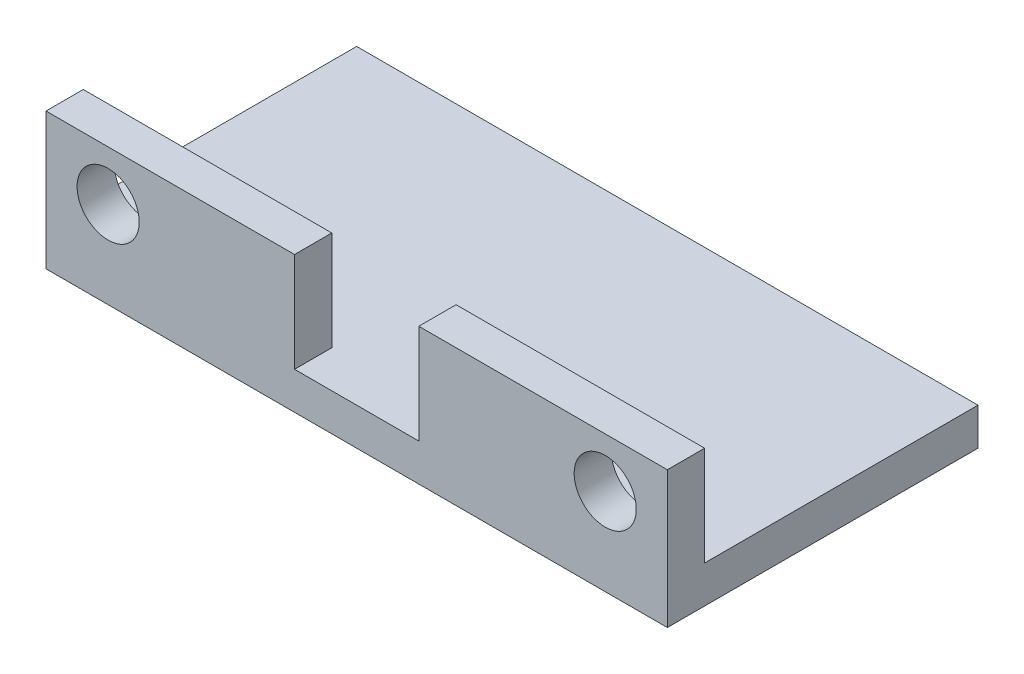
ISO-10303-21;
HEADER;
FILE_DESCRIPTION(('STEP AP214'),'2;1');
FILE_NAME('part.step','',(''),(''),'','','');
FILE_SCHEMA(('AUTOMOTIVE_DESIGN { 1 0 10303 214 1 1 1 1 }'));
ENDSEC;
DATA;
#1=APPLICATION_CONTEXT('core data for automotive mechanical design processes');
#2=APPLICATION_PROTOCOL_DEFINITION('international standard','automotive_design',2000,#1);
#3=PRODUCT_CONTEXT('',#1,'mechanical');
#4=PRODUCT('Part','Part','',(#3));
#5=PRODUCT_RELATED_PRODUCT_CATEGORY('part','',(#4));
#6=PRODUCT_DEFINITION_FORMATION('','',#4);
#7=PRODUCT_DEFINITION_CONTEXT('part definition',#1,'design');
#8=PRODUCT_DEFINITION('design','',#6,#7);
#9=PRODUCT_DEFINITION_SHAPE('','',#8);
#10=(LENGTH_UNIT() NAMED_UNIT(*) SI_UNIT(.MILLI.,.METRE.));
#11=(NAMED_UNIT(*) PLANE_ANGLE_UNIT() SI_UNIT($,.RADIAN.));
#12=(NAMED_UNIT(*) SI_UNIT($,.STERADIAN.) SOLID_ANGLE_UNIT());
#13=UNCERTAINTY_MEASURE_WITH_UNIT(LENGTH_MEASURE(1.E-05),#10,'distance_accuracy_value','');
#14=(GEOMETRIC_REPRESENTATION_CONTEXT(3) GLOBAL_UNCERTAINTY_ASSIGNED_CONTEXT((#13)) GLOBAL_UNIT_ASSIGNED_CONTEXT((#10,
#11,#12)) REPRESENTATION_CONTEXT('',''));
#15=CARTESIAN_POINT('',(0.,0.,0.));
#16=DIRECTION('',(0.,0.,1.));
#17=DIRECTION('',(1.,0.,0.));
#18=AXIS2_PLACEMENT_3D('',#15,#16,#17);
#19=CARTESIAN_POINT('',(0.,3.81,0.));
#20=DIRECTION('',(0.,1.,0.));
#21=DIRECTION('',(0.,0.,1.));
#22=AXIS2_PLACEMENT_3D('',#19,#20,#21);
#23=PLANE('',#22);
#24=DIRECTION('',(1.,0.,0.));
#25=VECTOR('',#24,1.);
#26=CARTESIAN_POINT('',(-31.75,3.81,15.875));
#27=LINE('',#26,#25);
#28=CARTESIAN_POINT('',(-6.34999999999999,3.81,15.875));
#29=VERTEX_POINT('',#28);
#30=CARTESIAN_POINT('',(6.35000000000001,3.81,15.875));
#31=VERTEX_POINT('',#30);
#32=EDGE_CURVE('E195',#29,#31,#27,.T.);
#33=ORIENTED_EDGE('',*,*,#32,.T.);
#34=DIRECTION('',(0.,0.,1.));
#35=VECTOR('',#34,1.);
#36=CARTESIAN_POINT('',(6.35000000000001,3.81,15.875));
#37=LINE('',#36,#35);
#38=CARTESIAN_POINT('',(6.35000000000001,3.81,12.065));
#39=VERTEX_POINT('',#38);
#40=EDGE_CURVE('E144',#39,#31,#37,.T.);
#41=ORIENTED_EDGE('',*,*,#40,.F.);
#42=DIRECTION('',(-1.,0.,0.));
#43=VECTOR('',#42,1.);
#44=CARTESIAN_POINT('',(6.35000000000001,3.81,12.065));
#45=LINE('',#44,#43);
#46=CARTESIAN_POINT('',(31.75,3.81,12.065));
#47=VERTEX_POINT('',#46);
#48=EDGE_CURVE('E140',#47,#39,#45,.T.);
#49=ORIENTED_EDGE('',*,*,#48,.F.);
#50=DIRECTION('',(0.,0.,-1.));
#51=VECTOR('',#50,1.);
#52=CARTESIAN_POINT('',(31.75,3.81,-15.875));
#53=LINE('',#52,#51);
#54=CARTESIAN_POINT('',(31.75,3.81,-15.875));
#55=VERTEX_POINT('',#54);
#56=EDGE_CURVE('E185',#47,#55,#53,.T.);
#57=ORIENTED_EDGE('',*,*,#56,.T.);
#58=DIRECTION('',(-1.,0.,0.));
#59=VECTOR('',#58,1.);
#60=CARTESIAN_POINT('',(-31.75,3.81,-15.875));
#61=LINE('',#60,#59);
#62=CARTESIAN_POINT('',(-31.75,3.81,-15.875));
#63=VERTEX_POINT('',#62);
#64=EDGE_CURVE('E188',#55,#63,#61,.T.);
#65=ORIENTED_EDGE('',*,*,#64,.T.);
#66=DIRECTION('',(0.,0.,1.));
#67=VECTOR('',#66,1.);
#68=CARTESIAN_POINT('',(-31.75,3.81,-15.875));
#69=LINE('',#68,#67);
#70=CARTESIAN_POINT('',(-31.75,3.81,12.065));
#71=VERTEX_POINT('',#70);
#72=EDGE_CURVE('E192',#63,#71,#69,.T.);
#73=ORIENTED_EDGE('',*,*,#72,.T.);
#74=DIRECTION('',(-1.,0.,0.));
#75=VECTOR('',#74,1.);
#76=CARTESIAN_POINT('',(-6.34999999999999,3.81,12.065));
#77=LINE('',#76,#75);
#78=CARTESIAN_POINT('',(-6.34999999999999,3.81,12.065));
#79=VERTEX_POINT('',#78);
#80=EDGE_CURVE('E64',#79,#71,#77,.T.);
#81=ORIENTED_EDGE('',*,*,#80,.F.);
#82=DIRECTION('',(0.,0.,-1.));
#83=VECTOR('',#82,1.);
#84=CARTESIAN_POINT('',(-6.34999999999999,3.81,15.875));
#85=LINE('',#84,#83);
#86=EDGE_CURVE('E147',#29,#79,#85,.T.);
#87=ORIENTED_EDGE('',*,*,#86,.F.);
#88=EDGE_LOOP('',(#33,#41,#49,#57,#65,#73,#81,#87));
#89=FACE_BOUND('',#88,.T.);
#90=ADVANCED_FACE('F40',(#89),#23,.T.);
#91=CARTESIAN_POINT('',(31.75,3.81,-15.875));
#92=DIRECTION('',(-1.,0.,0.));
#93=DIRECTION('',(0.,0.,1.));
#94=AXIS2_PLACEMENT_3D('',#91,#92,#93);
#95=PLANE('',#94);
#96=DIRECTION('',(0.,0.,-1.));
#97=VECTOR('',#96,1.);
#98=CARTESIAN_POINT('',(31.75,0.,-15.875));
#99=LINE('',#98,#97);
#100=CARTESIAN_POINT('',(31.75,0.,15.875));
#101=VERTEX_POINT('',#100);
#102=CARTESIAN_POINT('',(31.75,0.,-15.875));
#103=VERTEX_POINT('',#102);
#104=EDGE_CURVE('E184',#101,#103,#99,.T.);
#105=ORIENTED_EDGE('',*,*,#104,.T.);
#106=DIRECTION('',(0.,-1.,0.));
#107=VECTOR('',#106,1.);
#108=CARTESIAN_POINT('',(31.75,3.81,-15.875));
#109=LINE('',#108,#107);
#110=EDGE_CURVE('E11',#55,#103,#109,.T.);
#111=ORIENTED_EDGE('',*,*,#110,.F.);
#112=ORIENTED_EDGE('',*,*,#56,.F.);
#113=DIRECTION('',(0.,-1.,0.));
#114=VECTOR('',#113,1.);
#115=CARTESIAN_POINT('',(31.75,13.97,12.065));
#116=LINE('',#115,#114);
#117=CARTESIAN_POINT('',(31.75,13.97,12.065));
#118=VERTEX_POINT('',#117);
#119=EDGE_CURVE('E56',#118,#47,#116,.T.);
#120=ORIENTED_EDGE('',*,*,#119,.F.);
#121=DIRECTION('',(0.,0.,-1.));
#122=VECTOR('',#121,1.);
#123=CARTESIAN_POINT('',(31.75,13.97,15.875));
#124=LINE('',#123,#122);
#125=CARTESIAN_POINT('',(31.75,13.97,15.875));
#126=VERTEX_POINT('',#125);
#127=EDGE_CURVE('E130',#126,#118,#124,.T.);
#128=ORIENTED_EDGE('',*,*,#127,.F.);
#129=DIRECTION('',(0.,-1.,0.));
#130=VECTOR('',#129,1.);
#131=CARTESIAN_POINT('',(31.75,3.81,15.875));
#132=LINE('',#131,#130);
#133=EDGE_CURVE('E126',#126,#101,#132,.T.);
#134=ORIENTED_EDGE('',*,*,#133,.T.);
#135=EDGE_LOOP('',(#105,#111,#112,#120,#128,#134));
#136=FACE_BOUND('',#135,.T.);
#137=ADVANCED_FACE('F42',(#136),#95,.F.);
#138=CARTESIAN_POINT('',(-31.75,3.81,-15.875));
#139=DIRECTION('',(0.,0.,1.));
#140=DIRECTION('',(1.,0.,0.));
#141=AXIS2_PLACEMENT_3D('',#138,#139,#140);
#142=PLANE('',#141);
#143=DIRECTION('',(-1.,0.,0.));
#144=VECTOR('',#143,1.);
#145=CARTESIAN_POINT('',(-31.75,0.,-15.875));
#146=LINE('',#145,#144);
#147=CARTESIAN_POINT('',(-31.75,0.,-15.875));
#148=VERTEX_POINT('',#147);
#149=EDGE_CURVE('E201',#103,#148,#146,.T.);
#150=ORIENTED_EDGE('',*,*,#149,.T.);
#151=DIRECTION('',(0.,-1.,0.));
#152=VECTOR('',#151,1.);
#153=CARTESIAN_POINT('',(-31.75,3.81,-15.875));
#154=LINE('',#153,#152);
#155=EDGE_CURVE('E49',#63,#148,#154,.T.);
#156=ORIENTED_EDGE('',*,*,#155,.F.);
#157=ORIENTED_EDGE('',*,*,#64,.F.);
#158=ORIENTED_EDGE('',*,*,#110,.T.);
#159=EDGE_LOOP('',(#150,#156,#157,#158));
#160=FACE_BOUND('',#159,.T.);
#161=ADVANCED_FACE('F267',(#160),#142,.F.);
#162=CARTESIAN_POINT('',(-31.75,3.81,-15.875));
#163=DIRECTION('',(1.,0.,0.));
#164=DIRECTION('',(0.,0.,-1.));
#165=AXIS2_PLACEMENT_3D('',#162,#163,#164);
#166=PLANE('',#165);
#167=DIRECTION('',(0.,0.,1.));
#168=VECTOR('',#167,1.);
#169=CARTESIAN_POINT('',(-31.75,0.,-15.875));
#170=LINE('',#169,#168);
#171=CARTESIAN_POINT('',(-31.75,0.,15.875));
#172=VERTEX_POINT('',#171);
#173=EDGE_CURVE('E204',#148,#172,#170,.T.);
#174=ORIENTED_EDGE('',*,*,#173,.T.);
#175=DIRECTION('',(0.,-1.,0.));
#176=VECTOR('',#175,1.);
#177=CARTESIAN_POINT('',(-31.75,3.81,15.875));
#178=LINE('',#177,#176);
#179=CARTESIAN_POINT('',(-31.75,13.97,15.875));
#180=VERTEX_POINT('',#179);
#181=EDGE_CURVE('E211',#180,#172,#178,.T.);
#182=ORIENTED_EDGE('',*,*,#181,.F.);
#183=DIRECTION('',(0.,0.,1.));
#184=VECTOR('',#183,1.);
#185=CARTESIAN_POINT('',(-31.75,13.97,15.875));
#186=LINE('',#185,#184);
#187=CARTESIAN_POINT('',(-31.75,13.97,12.065));
#188=VERTEX_POINT('',#187);
#189=EDGE_CURVE('E164',#188,#180,#186,.T.);
#190=ORIENTED_EDGE('',*,*,#189,.F.);
#191=DIRECTION('',(0.,-1.,0.));
#192=VECTOR('',#191,1.);
#193=CARTESIAN_POINT('',(-31.75,13.97,12.065));
#194=LINE('',#193,#192);
#195=EDGE_CURVE('E177',#188,#71,#194,.T.);
#196=ORIENTED_EDGE('',*,*,#195,.T.);
#197=ORIENTED_EDGE('',*,*,#72,.F.);
#198=ORIENTED_EDGE('',*,*,#155,.T.);
#199=EDGE_LOOP('',(#174,#182,#190,#196,#197,#198));
#200=FACE_BOUND('',#199,.T.);
#201=ADVANCED_FACE('F220',(#200),#166,.F.);
#202=CARTESIAN_POINT('',(-31.75,3.81,15.875));
#203=DIRECTION('',(0.,0.,-1.));
#204=DIRECTION('',(-1.,0.,0.));
#205=AXIS2_PLACEMENT_3D('',#202,#203,#204);
#206=PLANE('',#205);
#207=CARTESIAN_POINT('',(-25.4,8.89,15.875));
#208=DIRECTION('',(0.,0.,-1.));
#209=DIRECTION('',(-1.,0.,0.));
#210=AXIS2_PLACEMENT_3D('',#207,#208,#209);
#211=CIRCLE('',#210,3.175);
#212=CARTESIAN_POINT('',(-28.575,8.89,15.875));
#213=VERTEX_POINT('',#212);
#214=EDGE_CURVE('E238',#213,#213,#211,.F.);
#215=ORIENTED_EDGE('',*,*,#214,.F.);
#216=EDGE_LOOP('',(#215));
#217=FACE_BOUND('',#216,.T.);
#218=CARTESIAN_POINT('',(25.4,8.89,15.875));
#219=DIRECTION('',(0.,0.,-1.));
#220=DIRECTION('',(-1.,0.,0.));
#221=AXIS2_PLACEMENT_3D('',#218,#219,#220);
#222=CIRCLE('',#221,3.175);
#223=CARTESIAN_POINT('',(22.225,8.89,15.875));
#224=VERTEX_POINT('',#223);
#225=EDGE_CURVE('E357',#224,#224,#222,.F.);
#226=ORIENTED_EDGE('',*,*,#225,.F.);
#227=EDGE_LOOP('',(#226));
#228=FACE_BOUND('',#227,.T.);
#229=DIRECTION('',(1.,0.,0.));
#230=VECTOR('',#229,1.);
#231=CARTESIAN_POINT('',(-31.75,0.,15.875));
#232=LINE('',#231,#230);
#233=EDGE_CURVE('E189',#172,#101,#232,.T.);
#234=ORIENTED_EDGE('',*,*,#233,.T.);
#235=ORIENTED_EDGE('',*,*,#133,.F.);
#236=DIRECTION('',(1.,0.,0.));
#237=VECTOR('',#236,1.);
#238=CARTESIAN_POINT('',(6.35000000000001,13.97,15.875));
#239=LINE('',#238,#237);
#240=CARTESIAN_POINT('',(6.35000000000001,13.97,15.875));
#241=VERTEX_POINT('',#240);
#242=EDGE_CURVE('E118',#241,#126,#239,.T.);
#243=ORIENTED_EDGE('',*,*,#242,.F.);
#244=DIRECTION('',(0.,-1.,0.));
#245=VECTOR('',#244,1.);
#246=CARTESIAN_POINT('',(6.35000000000001,13.97,15.875));
#247=LINE('',#246,#245);
#248=EDGE_CURVE('E123',#241,#31,#247,.T.);
#249=ORIENTED_EDGE('',*,*,#248,.T.);
#250=ORIENTED_EDGE('',*,*,#32,.F.);
#251=DIRECTION('',(0.,-1.,0.));
#252=VECTOR('',#251,1.);
#253=CARTESIAN_POINT('',(-6.34999999999999,13.97,15.875));
#254=LINE('',#253,#252);
#255=CARTESIAN_POINT('',(-6.34999999999999,13.97,15.875));
#256=VERTEX_POINT('',#255);
#257=EDGE_CURVE('E170',#256,#29,#254,.T.);
#258=ORIENTED_EDGE('',*,*,#257,.F.);
#259=DIRECTION('',(1.,0.,0.));
#260=VECTOR('',#259,1.);
#261=CARTESIAN_POINT('',(-6.34999999999999,13.97,15.875));
#262=LINE('',#261,#260);
#263=EDGE_CURVE('E168',#180,#256,#262,.T.);
#264=ORIENTED_EDGE('',*,*,#263,.F.);
#265=ORIENTED_EDGE('',*,*,#181,.T.);
#266=EDGE_LOOP('',(#234,#235,#243,#249,#250,#258,#264,#265));
#267=FACE_BOUND('',#266,.T.);
#268=ADVANCED_FACE('F120',(#217,#228,#267),#206,.F.);
#269=CARTESIAN_POINT('',(0.,0.,0.));
#270=DIRECTION('',(0.,1.,0.));
#271=DIRECTION('',(0.,0.,1.));
#272=AXIS2_PLACEMENT_3D('',#269,#270,#271);
#273=PLANE('',#272);
#274=ORIENTED_EDGE('',*,*,#104,.F.);
#275=ORIENTED_EDGE('',*,*,#233,.F.);
#276=ORIENTED_EDGE('',*,*,#173,.F.);
#277=ORIENTED_EDGE('',*,*,#149,.F.);
#278=EDGE_LOOP('',(#274,#275,#276,#277));
#279=FACE_BOUND('',#278,.T.);
#280=ADVANCED_FACE('F226',(#279),#273,.F.);
#281=CARTESIAN_POINT('',(-6.34999999999999,13.97,15.875));
#282=DIRECTION('',(-1.,0.,0.));
#283=DIRECTION('',(0.,0.,1.));
#284=AXIS2_PLACEMENT_3D('',#281,#282,#283);
#285=PLANE('',#284);
#286=ORIENTED_EDGE('',*,*,#86,.T.);
#287=DIRECTION('',(0.,-1.,0.));
#288=VECTOR('',#287,1.);
#289=CARTESIAN_POINT('',(-6.34999999999999,13.97,12.065));
#290=LINE('',#289,#288);
#291=CARTESIAN_POINT('',(-6.34999999999999,13.97,12.065));
#292=VERTEX_POINT('',#291);
#293=EDGE_CURVE('E181',#292,#79,#290,.T.);
#294=ORIENTED_EDGE('',*,*,#293,.F.);
#295=DIRECTION('',(0.,0.,-1.));
#296=VECTOR('',#295,1.);
#297=CARTESIAN_POINT('',(-6.34999999999999,13.97,15.875));
#298=LINE('',#297,#296);
#299=EDGE_CURVE('E157',#256,#292,#298,.T.);
#300=ORIENTED_EDGE('',*,*,#299,.F.);
#301=ORIENTED_EDGE('',*,*,#257,.T.);
#302=EDGE_LOOP('',(#286,#294,#300,#301));
#303=FACE_BOUND('',#302,.T.);
#304=ADVANCED_FACE('F244',(#303),#285,.F.);
#305=CARTESIAN_POINT('',(-6.34999999999999,13.97,12.065));
#306=DIRECTION('',(0.,0.,1.));
#307=DIRECTION('',(1.,0.,0.));
#308=AXIS2_PLACEMENT_3D('',#305,#306,#307);
#309=PLANE('',#308);
#310=CARTESIAN_POINT('',(-25.4,8.89,12.065));
#311=DIRECTION('',(0.,0.,-1.));
#312=DIRECTION('',(-1.,0.,0.));
#313=AXIS2_PLACEMENT_3D('',#310,#311,#312);
#314=CIRCLE('',#313,3.175);
#315=CARTESIAN_POINT('',(-28.575,8.89,12.065));
#316=VERTEX_POINT('',#315);
#317=EDGE_CURVE('E361',#316,#316,#314,.T.);
#318=ORIENTED_EDGE('',*,*,#317,.F.);
#319=EDGE_LOOP('',(#318));
#320=FACE_BOUND('',#319,.T.);
#321=ORIENTED_EDGE('',*,*,#80,.T.);
#322=ORIENTED_EDGE('',*,*,#195,.F.);
#323=DIRECTION('',(-1.,0.,0.));
#324=VECTOR('',#323,1.);
#325=CARTESIAN_POINT('',(-6.34999999999999,13.97,12.065));
#326=LINE('',#325,#324);
#327=EDGE_CURVE('E161',#292,#188,#326,.T.);
#328=ORIENTED_EDGE('',*,*,#327,.F.);
#329=ORIENTED_EDGE('',*,*,#293,.T.);
#330=EDGE_LOOP('',(#321,#322,#328,#329));
#331=FACE_BOUND('',#330,.T.);
#332=ADVANCED_FACE('F251',(#320,#331),#309,.F.);
#333=CARTESIAN_POINT('',(0.,13.97,0.));
#334=DIRECTION('',(0.,1.,0.));
#335=DIRECTION('',(0.,0.,1.));
#336=AXIS2_PLACEMENT_3D('',#333,#334,#335);
#337=PLANE('',#336);
#338=ORIENTED_EDGE('',*,*,#299,.T.);
#339=ORIENTED_EDGE('',*,*,#327,.T.);
#340=ORIENTED_EDGE('',*,*,#189,.T.);
#341=ORIENTED_EDGE('',*,*,#263,.T.);
#342=EDGE_LOOP('',(#338,#339,#340,#341));
#343=FACE_BOUND('',#342,.T.);
#344=ADVANCED_FACE('F247',(#343),#337,.T.);
#345=CARTESIAN_POINT('',(6.35000000000001,13.97,15.875));
#346=DIRECTION('',(1.,0.,0.));
#347=DIRECTION('',(0.,0.,-1.));
#348=AXIS2_PLACEMENT_3D('',#345,#346,#347);
#349=PLANE('',#348);
#350=ORIENTED_EDGE('',*,*,#40,.T.);
#351=ORIENTED_EDGE('',*,*,#248,.F.);
#352=DIRECTION('',(0.,0.,1.));
#353=VECTOR('',#352,1.);
#354=CARTESIAN_POINT('',(6.35000000000001,13.97,15.875));
#355=LINE('',#354,#353);
#356=CARTESIAN_POINT('',(6.35000000000001,13.97,12.065));
#357=VERTEX_POINT('',#356);
#358=EDGE_CURVE('E131',#357,#241,#355,.T.);
#359=ORIENTED_EDGE('',*,*,#358,.F.);
#360=DIRECTION('',(0.,-1.,0.));
#361=VECTOR('',#360,1.);
#362=CARTESIAN_POINT('',(6.35000000000001,13.97,12.065));
#363=LINE('',#362,#361);
#364=EDGE_CURVE('E153',#357,#39,#363,.T.);
#365=ORIENTED_EDGE('',*,*,#364,.T.);
#366=EDGE_LOOP('',(#350,#351,#359,#365));
#367=FACE_BOUND('',#366,.T.);
#368=ADVANCED_FACE('F142',(#367),#349,.F.);
#369=CARTESIAN_POINT('',(6.35000000000001,13.97,12.065));
#370=DIRECTION('',(0.,0.,1.));
#371=DIRECTION('',(1.,0.,0.));
#372=AXIS2_PLACEMENT_3D('',#369,#370,#371);
#373=PLANE('',#372);
#374=CARTESIAN_POINT('',(25.4,8.89,12.065));
#375=DIRECTION('',(0.,0.,-1.));
#376=DIRECTION('',(-1.,0.,0.));
#377=AXIS2_PLACEMENT_3D('',#374,#375,#376);
#378=CIRCLE('',#377,3.175);
#379=CARTESIAN_POINT('',(22.225,8.89,12.065));
#380=VERTEX_POINT('',#379);
#381=EDGE_CURVE('E354',#380,#380,#378,.T.);
#382=ORIENTED_EDGE('',*,*,#381,.F.);
#383=EDGE_LOOP('',(#382));
#384=FACE_BOUND('',#383,.T.);
#385=ORIENTED_EDGE('',*,*,#48,.T.);
#386=ORIENTED_EDGE('',*,*,#364,.F.);
#387=DIRECTION('',(-1.,0.,0.));
#388=VECTOR('',#387,1.);
#389=CARTESIAN_POINT('',(6.35000000000001,13.97,12.065));
#390=LINE('',#389,#388);
#391=EDGE_CURVE('E135',#118,#357,#390,.T.);
#392=ORIENTED_EDGE('',*,*,#391,.F.);
#393=ORIENTED_EDGE('',*,*,#119,.T.);
#394=EDGE_LOOP('',(#385,#386,#392,#393));
#395=FACE_BOUND('',#394,.T.);
#396=ADVANCED_FACE('F312',(#384,#395),#373,.F.);
#397=CARTESIAN_POINT('',(0.,13.97,0.));
#398=DIRECTION('',(0.,-1.,0.));
#399=DIRECTION('',(0.,0.,-1.));
#400=AXIS2_PLACEMENT_3D('',#397,#398,#399);
#401=PLANE('',#400);
#402=ORIENTED_EDGE('',*,*,#358,.T.);
#403=ORIENTED_EDGE('',*,*,#242,.T.);
#404=ORIENTED_EDGE('',*,*,#127,.T.);
#405=ORIENTED_EDGE('',*,*,#391,.T.);
#406=EDGE_LOOP('',(#402,#403,#404,#405));
#407=FACE_BOUND('',#406,.T.);
#408=ADVANCED_FACE('F134',(#407),#401,.F.);
#409=CARTESIAN_POINT('',(25.4,8.89,24.8552561210691));
#410=DIRECTION('',(0.,0.,-1.));
#411=DIRECTION('',(-1.,0.,0.));
#412=AXIS2_PLACEMENT_3D('',#409,#410,#411);
#413=CYLINDRICAL_SURFACE('',#412,3.175);
#414=ORIENTED_EDGE('',*,*,#225,.T.);
#415=EDGE_LOOP('',(#414));
#416=FACE_BOUND('',#415,.T.);
#417=ORIENTED_EDGE('',*,*,#381,.T.);
#418=EDGE_LOOP('',(#417));
#419=FACE_BOUND('',#418,.T.);
#420=ADVANCED_FACE('F322',(#416,#419),#413,.F.);
#421=CARTESIAN_POINT('',(-25.4,8.89,24.8552561210691));
#422=DIRECTION('',(0.,0.,-1.));
#423=DIRECTION('',(-1.,0.,0.));
#424=AXIS2_PLACEMENT_3D('',#421,#422,#423);
#425=CYLINDRICAL_SURFACE('',#424,3.175);
#426=ORIENTED_EDGE('',*,*,#214,.T.);
#427=EDGE_LOOP('',(#426));
#428=FACE_BOUND('',#427,.T.);
#429=ORIENTED_EDGE('',*,*,#317,.T.);
#430=EDGE_LOOP('',(#429));
#431=FACE_BOUND('',#430,.T.);
#432=ADVANCED_FACE('F334',(#428,#431),#425,.F.);
#433=CLOSED_SHELL('',(#90,#137,#161,#201,#268,#280,#304,#332,#344,#368,#396,#408,#420,#432));
#434=MANIFOLD_SOLID_BREP('B2',#433);
#435=ADVANCED_BREP_SHAPE_REPRESENTATION('',(#18,#434),#14);
#436=SHAPE_DEFINITION_REPRESENTATION(#9,#435);
ENDSEC;
END-ISO-10303-21;
